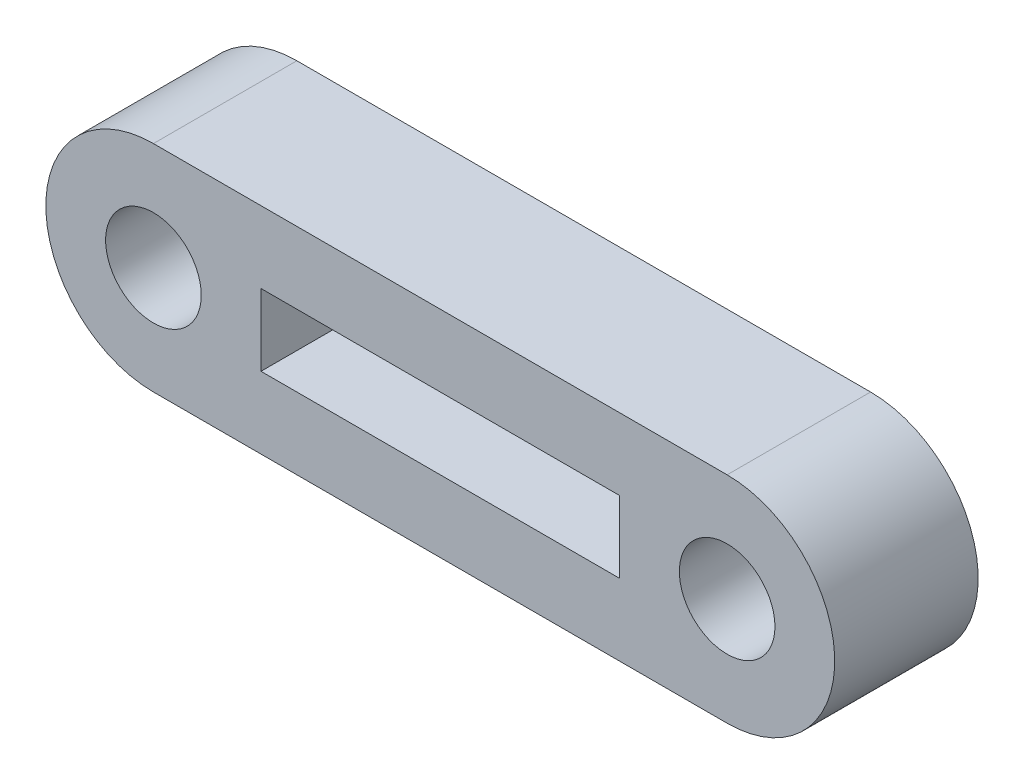
ISO-10303-21;
HEADER;
FILE_DESCRIPTION(('STEP AP214'),'2;1');
FILE_NAME('part.step','',(''),(''),'','','');
FILE_SCHEMA(('AUTOMOTIVE_DESIGN { 1 0 10303 214 1 1 1 1 }'));
ENDSEC;
DATA;
#1=APPLICATION_CONTEXT('core data for automotive mechanical design processes');
#2=APPLICATION_PROTOCOL_DEFINITION('international standard','automotive_design',2000,#1);
#3=PRODUCT_CONTEXT('',#1,'mechanical');
#4=PRODUCT('Part','Part','',(#3));
#5=PRODUCT_RELATED_PRODUCT_CATEGORY('part','',(#4));
#6=PRODUCT_DEFINITION_FORMATION('','',#4);
#7=PRODUCT_DEFINITION_CONTEXT('part definition',#1,'design');
#8=PRODUCT_DEFINITION('design','',#6,#7);
#9=PRODUCT_DEFINITION_SHAPE('','',#8);
#10=(LENGTH_UNIT() NAMED_UNIT(*) SI_UNIT(.MILLI.,.METRE.));
#11=(NAMED_UNIT(*) PLANE_ANGLE_UNIT() SI_UNIT($,.RADIAN.));
#12=(NAMED_UNIT(*) SI_UNIT($,.STERADIAN.) SOLID_ANGLE_UNIT());
#13=UNCERTAINTY_MEASURE_WITH_UNIT(LENGTH_MEASURE(1.E-05),#10,'distance_accuracy_value','');
#14=(GEOMETRIC_REPRESENTATION_CONTEXT(3) GLOBAL_UNCERTAINTY_ASSIGNED_CONTEXT((#13)) GLOBAL_UNIT_ASSIGNED_CONTEXT((#10,
#11,#12)) REPRESENTATION_CONTEXT('',''));
#15=CARTESIAN_POINT('',(0.,0.,0.));
#16=DIRECTION('',(0.,0.,1.));
#17=DIRECTION('',(1.,0.,0.));
#18=AXIS2_PLACEMENT_3D('',#15,#16,#17);
#19=CARTESIAN_POINT('',(-12.,0.,6.));
#20=DIRECTION('',(0.,0.,1.));
#21=DIRECTION('',(1.,0.,0.));
#22=AXIS2_PLACEMENT_3D('',#19,#20,#21);
#23=PLANE('',#22);
#24=CARTESIAN_POINT('',(-12.,0.,6.));
#25=DIRECTION('',(0.,0.,1.));
#26=DIRECTION('',(1.,0.,0.));
#27=AXIS2_PLACEMENT_3D('',#24,#25,#26);
#28=CIRCLE('',#27,2.);
#29=CARTESIAN_POINT('',(-10.,0.,6.));
#30=VERTEX_POINT('',#29);
#31=EDGE_CURVE('E137',#30,#30,#28,.T.);
#32=ORIENTED_EDGE('',*,*,#31,.F.);
#33=EDGE_LOOP('',(#32));
#34=FACE_BOUND('',#33,.T.);
#35=CARTESIAN_POINT('',(-12.,0.,6.));
#36=DIRECTION('',(0.,0.,1.));
#37=DIRECTION('',(1.,0.,0.));
#38=AXIS2_PLACEMENT_3D('',#35,#36,#37);
#39=CIRCLE('',#38,4.5);
#40=CARTESIAN_POINT('',(-12.,4.5,6.));
#41=VERTEX_POINT('',#40);
#42=CARTESIAN_POINT('',(-12.,-4.5,6.));
#43=VERTEX_POINT('',#42);
#44=EDGE_CURVE('E147',#41,#43,#39,.T.);
#45=ORIENTED_EDGE('',*,*,#44,.T.);
#46=DIRECTION('',(1.,0.,0.));
#47=VECTOR('',#46,1.);
#48=CARTESIAN_POINT('',(-12.,-4.5,6.));
#49=LINE('',#48,#47);
#50=CARTESIAN_POINT('',(12.,-4.5,6.));
#51=VERTEX_POINT('',#50);
#52=EDGE_CURVE('E150',#43,#51,#49,.T.);
#53=ORIENTED_EDGE('',*,*,#52,.T.);
#54=CARTESIAN_POINT('',(12.,0.,6.));
#55=DIRECTION('',(0.,0.,1.));
#56=DIRECTION('',(1.,0.,0.));
#57=AXIS2_PLACEMENT_3D('',#54,#55,#56);
#58=CIRCLE('',#57,4.5);
#59=CARTESIAN_POINT('',(12.,4.5,6.));
#60=VERTEX_POINT('',#59);
#61=EDGE_CURVE('E153',#51,#60,#58,.T.);
#62=ORIENTED_EDGE('',*,*,#61,.T.);
#63=DIRECTION('',(-1.,0.,0.));
#64=VECTOR('',#63,1.);
#65=CARTESIAN_POINT('',(-12.,4.5,6.));
#66=LINE('',#65,#64);
#67=EDGE_CURVE('E155',#60,#41,#66,.T.);
#68=ORIENTED_EDGE('',*,*,#67,.T.);
#69=EDGE_LOOP('',(#45,#53,#62,#68));
#70=FACE_BOUND('',#69,.T.);
#71=DIRECTION('',(-1.,0.,0.));
#72=VECTOR('',#71,1.);
#73=CARTESIAN_POINT('',(-7.5,1.5,6.));
#74=LINE('',#73,#72);
#75=CARTESIAN_POINT('',(7.5,1.5,6.));
#76=VERTEX_POINT('',#75);
#77=CARTESIAN_POINT('',(-7.5,1.5,6.));
#78=VERTEX_POINT('',#77);
#79=EDGE_CURVE('E116',#76,#78,#74,.T.);
#80=ORIENTED_EDGE('',*,*,#79,.F.);
#81=DIRECTION('',(0.,1.,0.));
#82=VECTOR('',#81,1.);
#83=CARTESIAN_POINT('',(7.5,1.5,6.));
#84=LINE('',#83,#82);
#85=CARTESIAN_POINT('',(7.5,-1.5,6.));
#86=VERTEX_POINT('',#85);
#87=EDGE_CURVE('E108',#86,#76,#84,.T.);
#88=ORIENTED_EDGE('',*,*,#87,.F.);
#89=DIRECTION('',(1.,0.,0.));
#90=VECTOR('',#89,1.);
#91=CARTESIAN_POINT('',(-7.5,-1.5,6.));
#92=LINE('',#91,#90);
#93=CARTESIAN_POINT('',(-7.5,-1.5,6.));
#94=VERTEX_POINT('',#93);
#95=EDGE_CURVE('E131',#94,#86,#92,.T.);
#96=ORIENTED_EDGE('',*,*,#95,.F.);
#97=DIRECTION('',(0.,-1.,0.));
#98=VECTOR('',#97,1.);
#99=CARTESIAN_POINT('',(-7.5,1.5,6.));
#100=LINE('',#99,#98);
#101=EDGE_CURVE('E129',#78,#94,#100,.T.);
#102=ORIENTED_EDGE('',*,*,#101,.F.);
#103=EDGE_LOOP('',(#80,#88,#96,#102));
#104=FACE_BOUND('',#103,.T.);
#105=CARTESIAN_POINT('',(12.,0.,6.));
#106=DIRECTION('',(0.,0.,1.));
#107=DIRECTION('',(1.,0.,0.));
#108=AXIS2_PLACEMENT_3D('',#105,#106,#107);
#109=CIRCLE('',#108,2.);
#110=CARTESIAN_POINT('',(14.,0.,6.));
#111=VERTEX_POINT('',#110);
#112=EDGE_CURVE('E237',#111,#111,#109,.T.);
#113=ORIENTED_EDGE('',*,*,#112,.F.);
#114=EDGE_LOOP('',(#113));
#115=FACE_BOUND('',#114,.T.);
#116=ADVANCED_FACE('F43',(#34,#70,#104,#115),#23,.T.);
#117=CARTESIAN_POINT('',(-12.,0.,0.));
#118=DIRECTION('',(0.,0.,1.));
#119=DIRECTION('',(1.,0.,0.));
#120=AXIS2_PLACEMENT_3D('',#117,#118,#119);
#121=PLANE('',#120);
#122=CARTESIAN_POINT('',(-12.,0.,0.));
#123=DIRECTION('',(0.,0.,1.));
#124=DIRECTION('',(1.,0.,0.));
#125=AXIS2_PLACEMENT_3D('',#122,#123,#124);
#126=CIRCLE('',#125,4.5);
#127=CARTESIAN_POINT('',(-12.,4.5,0.));
#128=VERTEX_POINT('',#127);
#129=CARTESIAN_POINT('',(-12.,-4.5,0.));
#130=VERTEX_POINT('',#129);
#131=EDGE_CURVE('E124',#128,#130,#126,.T.);
#132=ORIENTED_EDGE('',*,*,#131,.F.);
#133=DIRECTION('',(-1.,0.,0.));
#134=VECTOR('',#133,1.);
#135=CARTESIAN_POINT('',(-12.,4.5,0.));
#136=LINE('',#135,#134);
#137=CARTESIAN_POINT('',(12.,4.5,0.));
#138=VERTEX_POINT('',#137);
#139=EDGE_CURVE('E151',#138,#128,#136,.T.);
#140=ORIENTED_EDGE('',*,*,#139,.F.);
#141=CARTESIAN_POINT('',(12.,0.,0.));
#142=DIRECTION('',(0.,0.,1.));
#143=DIRECTION('',(1.,0.,0.));
#144=AXIS2_PLACEMENT_3D('',#141,#142,#143);
#145=CIRCLE('',#144,4.5);
#146=CARTESIAN_POINT('',(12.,-4.5,0.));
#147=VERTEX_POINT('',#146);
#148=EDGE_CURVE('E162',#147,#138,#145,.T.);
#149=ORIENTED_EDGE('',*,*,#148,.F.);
#150=DIRECTION('',(1.,0.,0.));
#151=VECTOR('',#150,1.);
#152=CARTESIAN_POINT('',(-12.,-4.5,0.));
#153=LINE('',#152,#151);
#154=EDGE_CURVE('E160',#130,#147,#153,.T.);
#155=ORIENTED_EDGE('',*,*,#154,.F.);
#156=EDGE_LOOP('',(#132,#140,#149,#155));
#157=FACE_BOUND('',#156,.T.);
#158=DIRECTION('',(0.,1.,0.));
#159=VECTOR('',#158,1.);
#160=CARTESIAN_POINT('',(7.5,1.5,0.));
#161=LINE('',#160,#159);
#162=CARTESIAN_POINT('',(7.5,-1.5,0.));
#163=VERTEX_POINT('',#162);
#164=CARTESIAN_POINT('',(7.5,1.5,0.));
#165=VERTEX_POINT('',#164);
#166=EDGE_CURVE('E66',#163,#165,#161,.T.);
#167=ORIENTED_EDGE('',*,*,#166,.T.);
#168=DIRECTION('',(-1.,0.,0.));
#169=VECTOR('',#168,1.);
#170=CARTESIAN_POINT('',(-7.5,1.5,0.));
#171=LINE('',#170,#169);
#172=CARTESIAN_POINT('',(-7.5,1.5,0.));
#173=VERTEX_POINT('',#172);
#174=EDGE_CURVE('E123',#165,#173,#171,.T.);
#175=ORIENTED_EDGE('',*,*,#174,.T.);
#176=DIRECTION('',(0.,-1.,0.));
#177=VECTOR('',#176,1.);
#178=CARTESIAN_POINT('',(-7.5,1.5,0.));
#179=LINE('',#178,#177);
#180=CARTESIAN_POINT('',(-7.5,-1.5,0.));
#181=VERTEX_POINT('',#180);
#182=EDGE_CURVE('E139',#173,#181,#179,.T.);
#183=ORIENTED_EDGE('',*,*,#182,.T.);
#184=DIRECTION('',(1.,0.,0.));
#185=VECTOR('',#184,1.);
#186=CARTESIAN_POINT('',(-7.5,-1.5,0.));
#187=LINE('',#186,#185);
#188=EDGE_CURVE('E117',#181,#163,#187,.T.);
#189=ORIENTED_EDGE('',*,*,#188,.T.);
#190=EDGE_LOOP('',(#167,#175,#183,#189));
#191=FACE_BOUND('',#190,.T.);
#192=CARTESIAN_POINT('',(-12.,0.,0.));
#193=DIRECTION('',(0.,0.,1.));
#194=DIRECTION('',(1.,0.,0.));
#195=AXIS2_PLACEMENT_3D('',#192,#193,#194);
#196=CIRCLE('',#195,2.);
#197=CARTESIAN_POINT('',(-10.,0.,0.));
#198=VERTEX_POINT('',#197);
#199=EDGE_CURVE('E243',#198,#198,#196,.T.);
#200=ORIENTED_EDGE('',*,*,#199,.T.);
#201=EDGE_LOOP('',(#200));
#202=FACE_BOUND('',#201,.T.);
#203=CARTESIAN_POINT('',(12.,0.,0.));
#204=DIRECTION('',(0.,0.,1.));
#205=DIRECTION('',(1.,0.,0.));
#206=AXIS2_PLACEMENT_3D('',#203,#204,#205);
#207=CIRCLE('',#206,2.);
#208=CARTESIAN_POINT('',(14.,0.,0.));
#209=VERTEX_POINT('',#208);
#210=EDGE_CURVE('E240',#209,#209,#207,.T.);
#211=ORIENTED_EDGE('',*,*,#210,.T.);
#212=EDGE_LOOP('',(#211));
#213=FACE_BOUND('',#212,.T.);
#214=ADVANCED_FACE('F180',(#157,#191,#202,#213),#121,.F.);
#215=CARTESIAN_POINT('',(-12.,0.,6.));
#216=DIRECTION('',(0.,0.,-1.));
#217=DIRECTION('',(-1.,0.,0.));
#218=AXIS2_PLACEMENT_3D('',#215,#216,#217);
#219=CYLINDRICAL_SURFACE('',#218,4.5);
#220=ORIENTED_EDGE('',*,*,#131,.T.);
#221=DIRECTION('',(0.,0.,-1.));
#222=VECTOR('',#221,1.);
#223=CARTESIAN_POINT('',(-12.,-4.5,6.));
#224=LINE('',#223,#222);
#225=EDGE_CURVE('E13',#43,#130,#224,.T.);
#226=ORIENTED_EDGE('',*,*,#225,.F.);
#227=ORIENTED_EDGE('',*,*,#44,.F.);
#228=DIRECTION('',(0.,0.,-1.));
#229=VECTOR('',#228,1.);
#230=CARTESIAN_POINT('',(-12.,4.5,6.));
#231=LINE('',#230,#229);
#232=EDGE_CURVE('E157',#41,#128,#231,.T.);
#233=ORIENTED_EDGE('',*,*,#232,.T.);
#234=EDGE_LOOP('',(#220,#226,#227,#233));
#235=FACE_BOUND('',#234,.T.);
#236=ADVANCED_FACE('F45',(#235),#219,.T.);
#237=CARTESIAN_POINT('',(-12.,-4.5,6.));
#238=DIRECTION('',(0.,1.,0.));
#239=DIRECTION('',(0.,0.,1.));
#240=AXIS2_PLACEMENT_3D('',#237,#238,#239);
#241=PLANE('',#240);
#242=ORIENTED_EDGE('',*,*,#154,.T.);
#243=DIRECTION('',(0.,0.,-1.));
#244=VECTOR('',#243,1.);
#245=CARTESIAN_POINT('',(12.,-4.5,6.));
#246=LINE('',#245,#244);
#247=EDGE_CURVE('E51',#51,#147,#246,.T.);
#248=ORIENTED_EDGE('',*,*,#247,.F.);
#249=ORIENTED_EDGE('',*,*,#52,.F.);
#250=ORIENTED_EDGE('',*,*,#225,.T.);
#251=EDGE_LOOP('',(#242,#248,#249,#250));
#252=FACE_BOUND('',#251,.T.);
#253=ADVANCED_FACE('F190',(#252),#241,.F.);
#254=CARTESIAN_POINT('',(12.,0.,6.));
#255=DIRECTION('',(0.,0.,-1.));
#256=DIRECTION('',(-1.,0.,0.));
#257=AXIS2_PLACEMENT_3D('',#254,#255,#256);
#258=CYLINDRICAL_SURFACE('',#257,4.5);
#259=ORIENTED_EDGE('',*,*,#148,.T.);
#260=DIRECTION('',(0.,0.,-1.));
#261=VECTOR('',#260,1.);
#262=CARTESIAN_POINT('',(12.,4.5,6.));
#263=LINE('',#262,#261);
#264=EDGE_CURVE('E167',#60,#138,#263,.T.);
#265=ORIENTED_EDGE('',*,*,#264,.F.);
#266=ORIENTED_EDGE('',*,*,#61,.F.);
#267=ORIENTED_EDGE('',*,*,#247,.T.);
#268=EDGE_LOOP('',(#259,#265,#266,#267));
#269=FACE_BOUND('',#268,.T.);
#270=ADVANCED_FACE('F174',(#269),#258,.T.);
#271=CARTESIAN_POINT('',(-12.,4.5,6.));
#272=DIRECTION('',(0.,-1.,0.));
#273=DIRECTION('',(0.,0.,-1.));
#274=AXIS2_PLACEMENT_3D('',#271,#272,#273);
#275=PLANE('',#274);
#276=ORIENTED_EDGE('',*,*,#139,.T.);
#277=ORIENTED_EDGE('',*,*,#232,.F.);
#278=ORIENTED_EDGE('',*,*,#67,.F.);
#279=ORIENTED_EDGE('',*,*,#264,.T.);
#280=EDGE_LOOP('',(#276,#277,#278,#279));
#281=FACE_BOUND('',#280,.T.);
#282=ADVANCED_FACE('F184',(#281),#275,.F.);
#283=CARTESIAN_POINT('',(7.5,1.5,6.));
#284=DIRECTION('',(-1.,0.,0.));
#285=DIRECTION('',(0.,0.,1.));
#286=AXIS2_PLACEMENT_3D('',#283,#284,#285);
#287=PLANE('',#286);
#288=ORIENTED_EDGE('',*,*,#166,.F.);
#289=DIRECTION('',(0.,0.,-1.));
#290=VECTOR('',#289,1.);
#291=CARTESIAN_POINT('',(7.5,-1.5,6.));
#292=LINE('',#291,#290);
#293=EDGE_CURVE('E112',#86,#163,#292,.T.);
#294=ORIENTED_EDGE('',*,*,#293,.F.);
#295=ORIENTED_EDGE('',*,*,#87,.T.);
#296=DIRECTION('',(0.,0.,-1.));
#297=VECTOR('',#296,1.);
#298=CARTESIAN_POINT('',(7.5,1.5,6.));
#299=LINE('',#298,#297);
#300=EDGE_CURVE('E111',#76,#165,#299,.T.);
#301=ORIENTED_EDGE('',*,*,#300,.T.);
#302=EDGE_LOOP('',(#288,#294,#295,#301));
#303=FACE_BOUND('',#302,.T.);
#304=ADVANCED_FACE('F110',(#303),#287,.T.);
#305=CARTESIAN_POINT('',(-7.5,1.5,6.));
#306=DIRECTION('',(0.,-1.,0.));
#307=DIRECTION('',(0.,0.,-1.));
#308=AXIS2_PLACEMENT_3D('',#305,#306,#307);
#309=PLANE('',#308);
#310=ORIENTED_EDGE('',*,*,#174,.F.);
#311=ORIENTED_EDGE('',*,*,#300,.F.);
#312=ORIENTED_EDGE('',*,*,#79,.T.);
#313=DIRECTION('',(0.,0.,-1.));
#314=VECTOR('',#313,1.);
#315=CARTESIAN_POINT('',(-7.5,1.5,6.));
#316=LINE('',#315,#314);
#317=EDGE_CURVE('E125',#78,#173,#316,.T.);
#318=ORIENTED_EDGE('',*,*,#317,.T.);
#319=EDGE_LOOP('',(#310,#311,#312,#318));
#320=FACE_BOUND('',#319,.T.);
#321=ADVANCED_FACE('F120',(#320),#309,.T.);
#322=CARTESIAN_POINT('',(-7.5,1.5,6.));
#323=DIRECTION('',(1.,0.,0.));
#324=DIRECTION('',(0.,1.,0.));
#325=AXIS2_PLACEMENT_3D('',#322,#323,#324);
#326=PLANE('',#325);
#327=ORIENTED_EDGE('',*,*,#182,.F.);
#328=ORIENTED_EDGE('',*,*,#317,.F.);
#329=ORIENTED_EDGE('',*,*,#101,.T.);
#330=DIRECTION('',(0.,0.,-1.));
#331=VECTOR('',#330,1.);
#332=CARTESIAN_POINT('',(-7.5,-1.5,6.));
#333=LINE('',#332,#331);
#334=EDGE_CURVE('E58',#94,#181,#333,.T.);
#335=ORIENTED_EDGE('',*,*,#334,.T.);
#336=EDGE_LOOP('',(#327,#328,#329,#335));
#337=FACE_BOUND('',#336,.T.);
#338=ADVANCED_FACE('F215',(#337),#326,.T.);
#339=CARTESIAN_POINT('',(-7.5,-1.5,6.));
#340=DIRECTION('',(0.,1.,0.));
#341=DIRECTION('',(0.,0.,1.));
#342=AXIS2_PLACEMENT_3D('',#339,#340,#341);
#343=PLANE('',#342);
#344=ORIENTED_EDGE('',*,*,#188,.F.);
#345=ORIENTED_EDGE('',*,*,#334,.F.);
#346=ORIENTED_EDGE('',*,*,#95,.T.);
#347=ORIENTED_EDGE('',*,*,#293,.T.);
#348=EDGE_LOOP('',(#344,#345,#346,#347));
#349=FACE_BOUND('',#348,.T.);
#350=ADVANCED_FACE('F219',(#349),#343,.T.);
#351=CARTESIAN_POINT('',(-12.,0.,6.));
#352=DIRECTION('',(0.,0.,-1.));
#353=DIRECTION('',(-1.,0.,0.));
#354=AXIS2_PLACEMENT_3D('',#351,#352,#353);
#355=CYLINDRICAL_SURFACE('',#354,2.);
#356=ORIENTED_EDGE('',*,*,#31,.T.);
#357=EDGE_LOOP('',(#356));
#358=FACE_BOUND('',#357,.T.);
#359=ORIENTED_EDGE('',*,*,#199,.F.);
#360=EDGE_LOOP('',(#359));
#361=FACE_BOUND('',#360,.T.);
#362=ADVANCED_FACE('F225',(#358,#361),#355,.F.);
#363=CARTESIAN_POINT('',(12.,0.,6.));
#364=DIRECTION('',(0.,0.,-1.));
#365=DIRECTION('',(-1.,0.,0.));
#366=AXIS2_PLACEMENT_3D('',#363,#364,#365);
#367=CYLINDRICAL_SURFACE('',#366,2.);
#368=ORIENTED_EDGE('',*,*,#112,.T.);
#369=EDGE_LOOP('',(#368));
#370=FACE_BOUND('',#369,.T.);
#371=ORIENTED_EDGE('',*,*,#210,.F.);
#372=EDGE_LOOP('',(#371));
#373=FACE_BOUND('',#372,.T.);
#374=ADVANCED_FACE('F228',(#370,#373),#367,.F.);
#375=CLOSED_SHELL('',(#116,#214,#236,#253,#270,#282,#304,#321,#338,#350,#362,#374));
#376=MANIFOLD_SOLID_BREP('B2',#375);
#377=ADVANCED_BREP_SHAPE_REPRESENTATION('',(#18,#376),#14);
#378=SHAPE_DEFINITION_REPRESENTATION(#9,#377);
ENDSEC;
END-ISO-10303-21;
